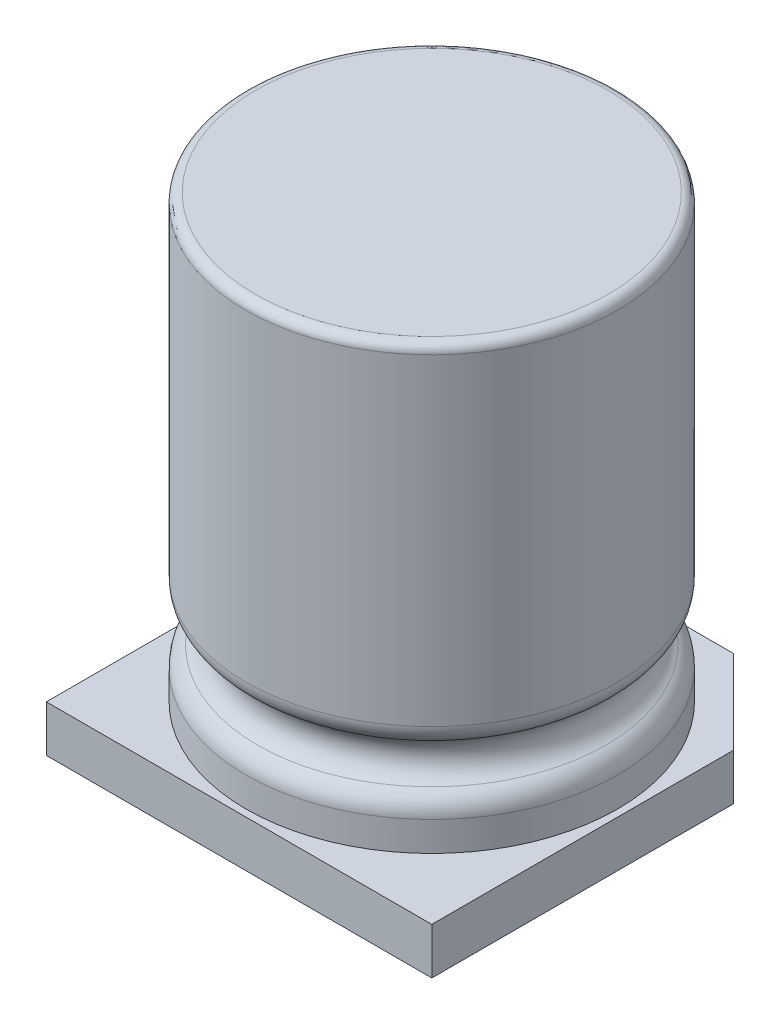
ISO-10303-21;
HEADER;
FILE_DESCRIPTION(('STEP AP214'),'2;1');
FILE_NAME('part.step','',(''),(''),'','','');
FILE_SCHEMA(('AUTOMOTIVE_DESIGN { 1 0 10303 214 1 1 1 1 }'));
ENDSEC;
DATA;
#1=APPLICATION_CONTEXT('core data for automotive mechanical design processes');
#2=APPLICATION_PROTOCOL_DEFINITION('international standard','automotive_design',2000,#1);
#3=PRODUCT_CONTEXT('',#1,'mechanical');
#4=PRODUCT('Part','Part','',(#3));
#5=PRODUCT_RELATED_PRODUCT_CATEGORY('part','',(#4));
#6=PRODUCT_DEFINITION_FORMATION('','',#4);
#7=PRODUCT_DEFINITION_CONTEXT('part definition',#1,'design');
#8=PRODUCT_DEFINITION('design','',#6,#7);
#9=PRODUCT_DEFINITION_SHAPE('','',#8);
#10=(LENGTH_UNIT() NAMED_UNIT(*) SI_UNIT(.MILLI.,.METRE.));
#11=(NAMED_UNIT(*) PLANE_ANGLE_UNIT() SI_UNIT($,.RADIAN.));
#12=(NAMED_UNIT(*) SI_UNIT($,.STERADIAN.) SOLID_ANGLE_UNIT());
#13=UNCERTAINTY_MEASURE_WITH_UNIT(LENGTH_MEASURE(1.E-05),#10,'distance_accuracy_value','');
#14=(GEOMETRIC_REPRESENTATION_CONTEXT(3) GLOBAL_UNCERTAINTY_ASSIGNED_CONTEXT((#13)) GLOBAL_UNIT_ASSIGNED_CONTEXT((#10,
#11,#12)) REPRESENTATION_CONTEXT('',''));
#15=CARTESIAN_POINT('',(0.,0.,0.));
#16=DIRECTION('',(0.,0.,1.));
#17=DIRECTION('',(1.,0.,0.));
#18=AXIS2_PLACEMENT_3D('',#15,#16,#17);
#19=CARTESIAN_POINT('',(0.,10.5,0.));
#20=DIRECTION('',(0.,-1.,0.));
#21=DIRECTION('',(0.,0.,-1.));
#22=AXIS2_PLACEMENT_3D('',#19,#20,#21);
#23=CYLINDRICAL_SURFACE('',#22,4.);
#24=CARTESIAN_POINT('',(0.,10.3,0.));
#25=DIRECTION('',(0.,1.,0.));
#26=DIRECTION('',(0.,0.,1.));
#27=AXIS2_PLACEMENT_3D('',#24,#25,#26);
#28=CIRCLE('',#27,4.);
#29=CARTESIAN_POINT('',(0.,10.3,4.));
#30=VERTEX_POINT('',#29);
#31=EDGE_CURVE('E11',#30,#30,#28,.F.);
#32=ORIENTED_EDGE('',*,*,#31,.T.);
#33=EDGE_LOOP('',(#32));
#34=FACE_BOUND('',#33,.T.);
#35=CARTESIAN_POINT('',(0.,3.36602540378466,0.));
#36=DIRECTION('',(0.,1.,0.));
#37=DIRECTION('',(0.,0.,1.));
#38=AXIS2_PLACEMENT_3D('',#35,#36,#37);
#39=CIRCLE('',#38,4.);
#40=CARTESIAN_POINT('',(0.,3.36602540378466,4.));
#41=VERTEX_POINT('',#40);
#42=EDGE_CURVE('E58',#41,#41,#39,.T.);
#43=ORIENTED_EDGE('',*,*,#42,.T.);
#44=EDGE_LOOP('',(#43));
#45=FACE_BOUND('',#44,.T.);
#46=ADVANCED_FACE('F43',(#34,#45),#23,.T.);
#47=CARTESIAN_POINT('',(0.,10.5,0.));
#48=DIRECTION('',(0.,1.,0.));
#49=DIRECTION('',(0.,0.,1.));
#50=AXIS2_PLACEMENT_3D('',#47,#48,#49);
#51=PLANE('',#50);
#52=CARTESIAN_POINT('',(0.,10.5,0.));
#53=DIRECTION('',(0.,1.,0.));
#54=DIRECTION('',(0.,0.,1.));
#55=AXIS2_PLACEMENT_3D('',#52,#53,#54);
#56=CIRCLE('',#55,3.8);
#57=CARTESIAN_POINT('',(0.,10.5,3.8));
#58=VERTEX_POINT('',#57);
#59=EDGE_CURVE('E50',#58,#58,#56,.T.);
#60=ORIENTED_EDGE('',*,*,#59,.T.);
#61=EDGE_LOOP('',(#60));
#62=FACE_BOUND('',#61,.T.);
#63=ADVANCED_FACE('F86',(#62),#51,.T.);
#64=CARTESIAN_POINT('',(0.,2.5,0.));
#65=DIRECTION('',(0.,1.,0.));
#66=DIRECTION('',(0.,0.,1.));
#67=AXIS2_PLACEMENT_3D('',#64,#65,#66);
#68=TOROIDAL_SURFACE('',#67,4.,0.5);
#69=CARTESIAN_POINT('',(0.,2.93301270189225,0.));
#70=DIRECTION('',(0.,-1.,0.));
#71=DIRECTION('',(0.,0.,-1.));
#72=AXIS2_PLACEMENT_3D('',#69,#70,#71);
#73=CIRCLE('',#72,3.75000000000008);
#74=CARTESIAN_POINT('',(0.,2.93301270189225,-3.75000000000008));
#75=VERTEX_POINT('',#74);
#76=EDGE_CURVE('E63',#75,#75,#73,.T.);
#77=ORIENTED_EDGE('',*,*,#76,.T.);
#78=EDGE_LOOP('',(#77));
#79=FACE_BOUND('',#78,.T.);
#80=CARTESIAN_POINT('',(0.,2.06698729810775,0.));
#81=DIRECTION('',(0.,1.,0.));
#82=DIRECTION('',(0.,0.,1.));
#83=AXIS2_PLACEMENT_3D('',#80,#81,#82);
#84=CIRCLE('',#83,3.75000000000008);
#85=CARTESIAN_POINT('',(0.,2.06698729810775,3.75000000000008));
#86=VERTEX_POINT('',#85);
#87=EDGE_CURVE('E66',#86,#86,#84,.T.);
#88=ORIENTED_EDGE('',*,*,#87,.T.);
#89=EDGE_LOOP('',(#88));
#90=FACE_BOUND('',#89,.T.);
#91=ADVANCED_FACE('F77',(#79,#90),#68,.F.);
#92=CARTESIAN_POINT('',(0.,1.,0.));
#93=DIRECTION('',(0.,1.,0.));
#94=DIRECTION('',(0.,0.,1.));
#95=AXIS2_PLACEMENT_3D('',#92,#93,#94);
#96=PLANE('',#95);
#97=CARTESIAN_POINT('',(0.,1.,0.));
#98=DIRECTION('',(0.,1.,0.));
#99=DIRECTION('',(0.,0.,1.));
#100=AXIS2_PLACEMENT_3D('',#97,#98,#99);
#101=CIRCLE('',#100,4.);
#102=CARTESIAN_POINT('',(0.,1.,4.));
#103=VERTEX_POINT('',#102);
#104=EDGE_CURVE('E69',#103,#103,#101,.T.);
#105=ORIENTED_EDGE('',*,*,#104,.F.);
#106=EDGE_LOOP('',(#105));
#107=FACE_BOUND('',#106,.T.);
#108=ADVANCED_FACE('F75',(#107),#96,.F.);
#109=CARTESIAN_POINT('',(0.,1.63397459621534,0.));
#110=DIRECTION('',(0.,-1.,0.));
#111=DIRECTION('',(0.,0.,-1.));
#112=AXIS2_PLACEMENT_3D('',#109,#110,#111);
#113=CIRCLE('',#112,4.);
#114=CARTESIAN_POINT('',(0.,1.63397459621534,-4.));
#115=VERTEX_POINT('',#114);
#116=EDGE_CURVE('E54',#115,#115,#113,.T.);
#117=ORIENTED_EDGE('',*,*,#116,.T.);
#118=EDGE_LOOP('',(#117));
#119=FACE_BOUND('',#118,.T.);
#120=ORIENTED_EDGE('',*,*,#104,.T.);
#121=EDGE_LOOP('',(#120));
#122=FACE_BOUND('',#121,.T.);
#123=ADVANCED_FACE('F73',(#119,#122),#23,.T.);
#124=CARTESIAN_POINT('',(0.,3.36602540378466,0.));
#125=DIRECTION('',(0.,1.,0.));
#126=DIRECTION('',(0.,0.,1.));
#127=AXIS2_PLACEMENT_3D('',#124,#125,#126);
#128=TOROIDAL_SURFACE('',#127,3.50000000000008,0.5);
#129=ORIENTED_EDGE('',*,*,#42,.F.);
#130=EDGE_LOOP('',(#129));
#131=FACE_BOUND('',#130,.T.);
#132=ORIENTED_EDGE('',*,*,#76,.F.);
#133=EDGE_LOOP('',(#132));
#134=FACE_BOUND('',#133,.T.);
#135=ADVANCED_FACE('F83',(#131,#134),#128,.T.);
#136=CARTESIAN_POINT('',(0.,1.63397459621534,0.));
#137=DIRECTION('',(0.,-1.,0.));
#138=DIRECTION('',(0.,0.,-1.));
#139=AXIS2_PLACEMENT_3D('',#136,#137,#138);
#140=TOROIDAL_SURFACE('',#139,3.50000000000008,0.5);
#141=ORIENTED_EDGE('',*,*,#116,.F.);
#142=EDGE_LOOP('',(#141));
#143=FACE_BOUND('',#142,.T.);
#144=ORIENTED_EDGE('',*,*,#87,.F.);
#145=EDGE_LOOP('',(#144));
#146=FACE_BOUND('',#145,.T.);
#147=ADVANCED_FACE('F97',(#143,#146),#140,.T.);
#148=CARTESIAN_POINT('',(0.,10.3,0.));
#149=DIRECTION('',(0.,1.,0.));
#150=DIRECTION('',(0.,0.,1.));
#151=AXIS2_PLACEMENT_3D('',#148,#149,#150);
#152=TOROIDAL_SURFACE('',#151,3.8,0.2);
#153=ORIENTED_EDGE('',*,*,#31,.F.);
#154=EDGE_LOOP('',(#153));
#155=FACE_BOUND('',#154,.T.);
#156=ORIENTED_EDGE('',*,*,#59,.F.);
#157=EDGE_LOOP('',(#156));
#158=FACE_BOUND('',#157,.T.);
#159=ADVANCED_FACE('F45',(#155,#158),#152,.T.);
#160=CLOSED_SHELL('',(#46,#63,#91,#108,#123,#135,#147,#159));
#161=MANIFOLD_SOLID_BREP('B2',#160);
#162=CARTESIAN_POINT('',(4.15,1.,-4.15));
#163=DIRECTION('',(-1.,0.,0.));
#164=DIRECTION('',(0.,0.,1.));
#165=AXIS2_PLACEMENT_3D('',#162,#163,#164);
#166=PLANE('',#165);
#167=DIRECTION('',(0.,0.,-1.));
#168=VECTOR('',#167,1.);
#169=CARTESIAN_POINT('',(4.15,0.,-4.15));
#170=LINE('',#169,#168);
#171=CARTESIAN_POINT('',(4.15,0.,4.15));
#172=VERTEX_POINT('',#171);
#173=CARTESIAN_POINT('',(4.15,0.,-2.34999999999999));
#174=VERTEX_POINT('',#173);
#175=EDGE_CURVE('E237',#172,#174,#170,.T.);
#176=ORIENTED_EDGE('',*,*,#175,.T.);
#177=DIRECTION('',(0.,1.,0.));
#178=VECTOR('',#177,1.);
#179=CARTESIAN_POINT('',(4.15,1.,-2.34999999999999));
#180=LINE('',#179,#178);
#181=CARTESIAN_POINT('',(4.15,1.,-2.34999999999999));
#182=VERTEX_POINT('',#181);
#183=EDGE_CURVE('E181',#174,#182,#180,.T.);
#184=ORIENTED_EDGE('',*,*,#183,.T.);
#185=DIRECTION('',(0.,0.,-1.));
#186=VECTOR('',#185,1.);
#187=CARTESIAN_POINT('',(4.15,1.,-4.15));
#188=LINE('',#187,#186);
#189=CARTESIAN_POINT('',(4.15,1.,4.15));
#190=VERTEX_POINT('',#189);
#191=EDGE_CURVE('E244',#190,#182,#188,.T.);
#192=ORIENTED_EDGE('',*,*,#191,.F.);
#193=DIRECTION('',(0.,-1.,0.));
#194=VECTOR('',#193,1.);
#195=CARTESIAN_POINT('',(4.15,1.,4.15));
#196=LINE('',#195,#194);
#197=EDGE_CURVE('E229',#190,#172,#196,.T.);
#198=ORIENTED_EDGE('',*,*,#197,.T.);
#199=EDGE_LOOP('',(#176,#184,#192,#198));
#200=FACE_BOUND('',#199,.T.);
#201=ADVANCED_FACE('F158',(#200),#166,.F.);
#202=CARTESIAN_POINT('',(-4.15,1.,-4.15));
#203=DIRECTION('',(0.,0.,1.));
#204=DIRECTION('',(1.,0.,0.));
#205=AXIS2_PLACEMENT_3D('',#202,#203,#204);
#206=PLANE('',#205);
#207=DIRECTION('',(-1.,0.,0.));
#208=VECTOR('',#207,1.);
#209=CARTESIAN_POINT('',(-4.15,1.,-4.15));
#210=LINE('',#209,#208);
#211=CARTESIAN_POINT('',(2.35,1.,-4.15));
#212=VERTEX_POINT('',#211);
#213=CARTESIAN_POINT('',(-2.34999999999999,1.,-4.15));
#214=VERTEX_POINT('',#213);
#215=EDGE_CURVE('E219',#212,#214,#210,.T.);
#216=ORIENTED_EDGE('',*,*,#215,.F.);
#217=DIRECTION('',(0.,-1.,0.));
#218=VECTOR('',#217,1.);
#219=CARTESIAN_POINT('',(2.35,1.,-4.15));
#220=LINE('',#219,#218);
#221=CARTESIAN_POINT('',(2.35,0.,-4.15));
#222=VERTEX_POINT('',#221);
#223=EDGE_CURVE('E247',#212,#222,#220,.T.);
#224=ORIENTED_EDGE('',*,*,#223,.T.);
#225=DIRECTION('',(-1.,0.,0.));
#226=VECTOR('',#225,1.);
#227=CARTESIAN_POINT('',(-4.15,0.,-4.15));
#228=LINE('',#227,#226);
#229=CARTESIAN_POINT('',(-2.34999999999999,0.,-4.15));
#230=VERTEX_POINT('',#229);
#231=EDGE_CURVE('E239',#222,#230,#228,.T.);
#232=ORIENTED_EDGE('',*,*,#231,.T.);
#233=DIRECTION('',(0.,1.,0.));
#234=VECTOR('',#233,1.);
#235=CARTESIAN_POINT('',(-2.34999999999999,1.,-4.15));
#236=LINE('',#235,#234);
#237=EDGE_CURVE('E228',#230,#214,#236,.T.);
#238=ORIENTED_EDGE('',*,*,#237,.T.);
#239=EDGE_LOOP('',(#216,#224,#232,#238));
#240=FACE_BOUND('',#239,.T.);
#241=ADVANCED_FACE('F260',(#240),#206,.F.);
#242=CARTESIAN_POINT('',(-4.15,1.,-4.15));
#243=DIRECTION('',(1.,0.,0.));
#244=DIRECTION('',(0.,0.,-1.));
#245=AXIS2_PLACEMENT_3D('',#242,#243,#244);
#246=PLANE('',#245);
#247=DIRECTION('',(0.,0.,1.));
#248=VECTOR('',#247,1.);
#249=CARTESIAN_POINT('',(-4.15,1.,-4.15));
#250=LINE('',#249,#248);
#251=CARTESIAN_POINT('',(-4.15,1.,-2.35));
#252=VERTEX_POINT('',#251);
#253=CARTESIAN_POINT('',(-4.15,1.,4.15));
#254=VERTEX_POINT('',#253);
#255=EDGE_CURVE('E211',#252,#254,#250,.T.);
#256=ORIENTED_EDGE('',*,*,#255,.F.);
#257=DIRECTION('',(0.,-1.,0.));
#258=VECTOR('',#257,1.);
#259=CARTESIAN_POINT('',(-4.15,1.,-2.35));
#260=LINE('',#259,#258);
#261=CARTESIAN_POINT('',(-4.15,0.,-2.35));
#262=VERTEX_POINT('',#261);
#263=EDGE_CURVE('E41',#252,#262,#260,.T.);
#264=ORIENTED_EDGE('',*,*,#263,.T.);
#265=DIRECTION('',(0.,0.,1.));
#266=VECTOR('',#265,1.);
#267=CARTESIAN_POINT('',(-4.15,0.,-4.15));
#268=LINE('',#267,#266);
#269=CARTESIAN_POINT('',(-4.15,0.,4.15));
#270=VERTEX_POINT('',#269);
#271=EDGE_CURVE('E225',#262,#270,#268,.T.);
#272=ORIENTED_EDGE('',*,*,#271,.T.);
#273=DIRECTION('',(0.,-1.,0.));
#274=VECTOR('',#273,1.);
#275=CARTESIAN_POINT('',(-4.15,1.,4.15));
#276=LINE('',#275,#274);
#277=EDGE_CURVE('E222',#254,#270,#276,.T.);
#278=ORIENTED_EDGE('',*,*,#277,.F.);
#279=EDGE_LOOP('',(#256,#264,#272,#278));
#280=FACE_BOUND('',#279,.T.);
#281=ADVANCED_FACE('F223',(#280),#246,.F.);
#282=CARTESIAN_POINT('',(-4.15,1.,4.15));
#283=DIRECTION('',(0.,0.,-1.));
#284=DIRECTION('',(-1.,0.,0.));
#285=AXIS2_PLACEMENT_3D('',#282,#283,#284);
#286=PLANE('',#285);
#287=DIRECTION('',(1.,0.,0.));
#288=VECTOR('',#287,1.);
#289=CARTESIAN_POINT('',(-4.15,0.,4.15));
#290=LINE('',#289,#288);
#291=EDGE_CURVE('E243',#270,#172,#290,.T.);
#292=ORIENTED_EDGE('',*,*,#291,.T.);
#293=ORIENTED_EDGE('',*,*,#197,.F.);
#294=DIRECTION('',(1.,0.,0.));
#295=VECTOR('',#294,1.);
#296=CARTESIAN_POINT('',(-4.15,1.,4.15));
#297=LINE('',#296,#295);
#298=EDGE_CURVE('E215',#254,#190,#297,.T.);
#299=ORIENTED_EDGE('',*,*,#298,.F.);
#300=ORIENTED_EDGE('',*,*,#277,.T.);
#301=EDGE_LOOP('',(#292,#293,#299,#300));
#302=FACE_BOUND('',#301,.T.);
#303=ADVANCED_FACE('F231',(#302),#286,.F.);
#304=CARTESIAN_POINT('',(0.,1.,0.));
#305=DIRECTION('',(0.,1.,0.));
#306=DIRECTION('',(0.,0.,1.));
#307=AXIS2_PLACEMENT_3D('',#304,#305,#306);
#308=PLANE('',#307);
#309=ORIENTED_EDGE('',*,*,#191,.T.);
#310=DIRECTION('',(0.707106781186547,0.,0.707106781186548));
#311=VECTOR('',#310,1.);
#312=CARTESIAN_POINT('',(3.25,1.,-3.24999999999999));
#313=LINE('',#312,#311);
#314=EDGE_CURVE('E166',#182,#212,#313,.F.);
#315=ORIENTED_EDGE('',*,*,#314,.T.);
#316=ORIENTED_EDGE('',*,*,#215,.T.);
#317=DIRECTION('',(0.707106781186549,0.,-0.707106781186547));
#318=VECTOR('',#317,1.);
#319=CARTESIAN_POINT('',(-3.24999999999999,1.,-3.25));
#320=LINE('',#319,#318);
#321=EDGE_CURVE('E173',#214,#252,#320,.F.);
#322=ORIENTED_EDGE('',*,*,#321,.T.);
#323=ORIENTED_EDGE('',*,*,#255,.T.);
#324=ORIENTED_EDGE('',*,*,#298,.T.);
#325=EDGE_LOOP('',(#309,#315,#316,#322,#323,#324));
#326=FACE_BOUND('',#325,.T.);
#327=ADVANCED_FACE('F213',(#326),#308,.T.);
#328=CARTESIAN_POINT('',(0.,0.,0.));
#329=DIRECTION('',(0.,1.,0.));
#330=DIRECTION('',(0.,0.,1.));
#331=AXIS2_PLACEMENT_3D('',#328,#329,#330);
#332=PLANE('',#331);
#333=ORIENTED_EDGE('',*,*,#231,.F.);
#334=DIRECTION('',(-0.707106781186547,0.,-0.707106781186548));
#335=VECTOR('',#334,1.);
#336=CARTESIAN_POINT('',(2.35,0.,-4.15));
#337=LINE('',#336,#335);
#338=EDGE_CURVE('E252',#222,#174,#337,.F.);
#339=ORIENTED_EDGE('',*,*,#338,.T.);
#340=ORIENTED_EDGE('',*,*,#175,.F.);
#341=ORIENTED_EDGE('',*,*,#291,.F.);
#342=ORIENTED_EDGE('',*,*,#271,.F.);
#343=DIRECTION('',(-0.707106781186549,0.,0.707106781186547));
#344=VECTOR('',#343,1.);
#345=CARTESIAN_POINT('',(-4.15,0.,-2.35));
#346=LINE('',#345,#344);
#347=EDGE_CURVE('E250',#262,#230,#346,.F.);
#348=ORIENTED_EDGE('',*,*,#347,.T.);
#349=EDGE_LOOP('',(#333,#339,#340,#341,#342,#348));
#350=FACE_BOUND('',#349,.T.);
#351=ADVANCED_FACE('F266',(#350),#332,.F.);
#352=CARTESIAN_POINT('',(2.35,1.,-4.15));
#353=DIRECTION('',(-0.707106781186548,0.,0.707106781186547));
#354=DIRECTION('',(0.,-1.,0.));
#355=AXIS2_PLACEMENT_3D('',#352,#353,#354);
#356=PLANE('',#355);
#357=ORIENTED_EDGE('',*,*,#314,.F.);
#358=ORIENTED_EDGE('',*,*,#183,.F.);
#359=ORIENTED_EDGE('',*,*,#338,.F.);
#360=ORIENTED_EDGE('',*,*,#223,.F.);
#361=EDGE_LOOP('',(#357,#358,#359,#360));
#362=FACE_BOUND('',#361,.T.);
#363=ADVANCED_FACE('F263',(#362),#356,.F.);
#364=CARTESIAN_POINT('',(-4.15,1.,-2.35));
#365=DIRECTION('',(0.707106781186546,0.,0.707106781186548));
#366=DIRECTION('',(0.,-1.,0.));
#367=AXIS2_PLACEMENT_3D('',#364,#365,#366);
#368=PLANE('',#367);
#369=ORIENTED_EDGE('',*,*,#321,.F.);
#370=ORIENTED_EDGE('',*,*,#237,.F.);
#371=ORIENTED_EDGE('',*,*,#347,.F.);
#372=ORIENTED_EDGE('',*,*,#263,.F.);
#373=EDGE_LOOP('',(#369,#370,#371,#372));
#374=FACE_BOUND('',#373,.T.);
#375=ADVANCED_FACE('F160',(#374),#368,.F.);
#376=CLOSED_SHELL('',(#201,#241,#281,#303,#327,#351,#363,#375));
#377=MANIFOLD_SOLID_BREP('B6',#376);
#378=ADVANCED_BREP_SHAPE_REPRESENTATION('',(#18,#161,#377),#14);
#379=SHAPE_DEFINITION_REPRESENTATION(#9,#378);
ENDSEC;
END-ISO-10303-21;
